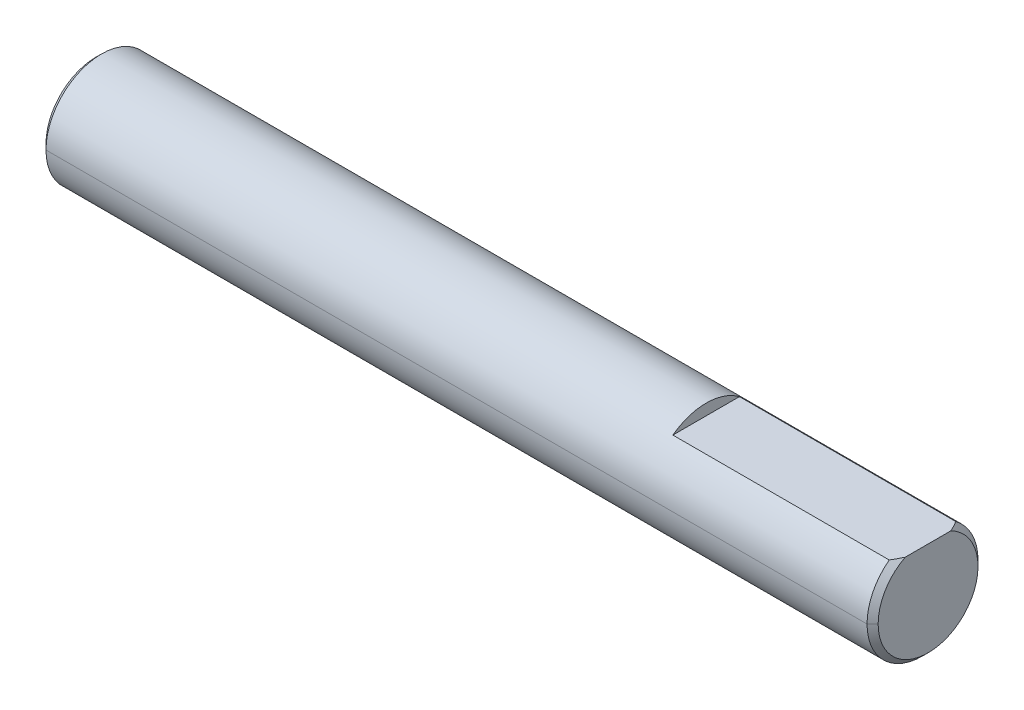
ISO-10303-21;
HEADER;
FILE_DESCRIPTION(('STEP AP214'),'2;1');
FILE_NAME('part.step','',(''),(''),'','','');
FILE_SCHEMA(('AUTOMOTIVE_DESIGN { 1 0 10303 214 1 1 1 1 }'));
ENDSEC;
DATA;
#1=APPLICATION_CONTEXT('core data for automotive mechanical design processes');
#2=APPLICATION_PROTOCOL_DEFINITION('international standard','automotive_design',2000,#1);
#3=PRODUCT_CONTEXT('',#1,'mechanical');
#4=PRODUCT('Part','Part','',(#3));
#5=PRODUCT_RELATED_PRODUCT_CATEGORY('part','',(#4));
#6=PRODUCT_DEFINITION_FORMATION('','',#4);
#7=PRODUCT_DEFINITION_CONTEXT('part definition',#1,'design');
#8=PRODUCT_DEFINITION('design','',#6,#7);
#9=PRODUCT_DEFINITION_SHAPE('','',#8);
#10=(LENGTH_UNIT() NAMED_UNIT(*) SI_UNIT(.MILLI.,.METRE.));
#11=(NAMED_UNIT(*) PLANE_ANGLE_UNIT() SI_UNIT($,.RADIAN.));
#12=(NAMED_UNIT(*) SI_UNIT($,.STERADIAN.) SOLID_ANGLE_UNIT());
#13=UNCERTAINTY_MEASURE_WITH_UNIT(LENGTH_MEASURE(1.E-05),#10,'distance_accuracy_value','');
#14=(GEOMETRIC_REPRESENTATION_CONTEXT(3) GLOBAL_UNCERTAINTY_ASSIGNED_CONTEXT((#13)) GLOBAL_UNIT_ASSIGNED_CONTEXT((#10,
#11,#12)) REPRESENTATION_CONTEXT('',''));
#15=CARTESIAN_POINT('',(0.,0.,0.));
#16=DIRECTION('',(0.,0.,1.));
#17=DIRECTION('',(1.,0.,0.));
#18=AXIS2_PLACEMENT_3D('',#15,#16,#17);
#19=CARTESIAN_POINT('',(75.,4.5,0.));
#20=DIRECTION('',(-1.,0.,0.));
#21=DIRECTION('',(0.,0.,1.));
#22=AXIS2_PLACEMENT_3D('',#19,#20,#21);
#23=PLANE('',#22);
#24=DIRECTION('',(0.,0.,-1.));
#25=VECTOR('',#24,1.);
#26=CARTESIAN_POINT('',(75.,4.,0.));
#27=LINE('',#26,#25);
#28=CARTESIAN_POINT('',(75.,4.,2.06155281280883));
#29=VERTEX_POINT('',#28);
#30=CARTESIAN_POINT('',(75.,4.,-2.06155281280883));
#31=VERTEX_POINT('',#30);
#32=EDGE_CURVE('E10',#29,#31,#27,.T.);
#33=ORIENTED_EDGE('',*,*,#32,.F.);
#34=CARTESIAN_POINT('',(75.,0.,0.));
#35=DIRECTION('',(1.,0.,0.));
#36=DIRECTION('',(0.,0.,-1.));
#37=AXIS2_PLACEMENT_3D('',#34,#35,#36);
#38=CIRCLE('',#37,4.5);
#39=CARTESIAN_POINT('',(74.9999999999988,0.,4.49999999999868));
#40=VERTEX_POINT('',#39);
#41=EDGE_CURVE('E24',#29,#40,#38,.T.);
#42=ORIENTED_EDGE('',*,*,#41,.T.);
#43=CARTESIAN_POINT('',(75.,0.,0.));
#44=DIRECTION('',(1.,0.,0.));
#45=DIRECTION('',(0.,0.,-1.));
#46=AXIS2_PLACEMENT_3D('',#43,#44,#45);
#47=CIRCLE('',#46,4.5);
#48=EDGE_CURVE('E461',#40,#31,#47,.T.);
#49=ORIENTED_EDGE('',*,*,#48,.T.);
#50=EDGE_LOOP('',(#33,#42,#49));
#51=FACE_BOUND('',#50,.T.);
#52=ADVANCED_FACE('F16',(#51),#23,.F.);
#53=CARTESIAN_POINT('',(74.5,0.,0.));
#54=DIRECTION('',(-1.,0.,0.));
#55=DIRECTION('',(0.,0.,1.));
#56=AXIS2_PLACEMENT_3D('',#53,#54,#55);
#57=CONICAL_SURFACE('',#56,5.,0.7853981634);
#58=CARTESIAN_POINT('',(74.5,0.,0.));
#59=DIRECTION('',(1.,0.,0.));
#60=DIRECTION('',(0.,0.,-1.));
#61=AXIS2_PLACEMENT_3D('',#58,#59,#60);
#62=CIRCLE('',#61,5.);
#63=CARTESIAN_POINT('',(74.5,0.,5.));
#64=VERTEX_POINT('',#63);
#65=CARTESIAN_POINT('',(74.5,0.,-5.));
#66=VERTEX_POINT('',#65);
#67=EDGE_CURVE('E457',#64,#66,#62,.T.);
#68=ORIENTED_EDGE('',*,*,#67,.T.);
#69=CARTESIAN_POINT('',(74.5,0.,0.));
#70=DIRECTION('',(1.,0.,0.));
#71=DIRECTION('',(0.,0.,-1.));
#72=AXIS2_PLACEMENT_3D('',#69,#70,#71);
#73=CIRCLE('',#72,5.);
#74=CARTESIAN_POINT('',(74.5,4.,-3.));
#75=VERTEX_POINT('',#74);
#76=EDGE_CURVE('E455',#66,#75,#73,.T.);
#77=ORIENTED_EDGE('',*,*,#76,.T.);
#78=CARTESIAN_POINT('',(75.,4.,-2.06155281280886));
#79=CARTESIAN_POINT('',(74.8518662474413,4.,-2.38490222320115));
#80=CARTESIAN_POINT('',(74.6823432963807,4.,-2.69609450603217));
#81=CARTESIAN_POINT('',(74.5,4.,-3.));
#82=B_SPLINE_CURVE_WITH_KNOTS('',3,(#78,#79,#80,#81),.UNSPECIFIED.,.F.,.F.,(4,4),
(0.0147760264440065,0.0158503428778367),.UNSPECIFIED.);
#83=EDGE_CURVE('E454',#31,#75,#82,.T.);
#84=ORIENTED_EDGE('',*,*,#83,.F.);
#85=ORIENTED_EDGE('',*,*,#48,.F.);
#86=DIRECTION('',(-0.707106781184743,0.,0.707106781188353));
#87=VECTOR('',#86,1.);
#88=CARTESIAN_POINT('',(74.9999999999988,0.,4.49999999999868));
#89=LINE('',#88,#87);
#90=EDGE_CURVE('E470',#40,#64,#89,.T.);
#91=ORIENTED_EDGE('',*,*,#90,.T.);
#92=EDGE_LOOP('',(#68,#77,#84,#85,#91));
#93=FACE_BOUND('',#92,.T.);
#94=ADVANCED_FACE('F435',(#93),#57,.T.);
#95=CARTESIAN_POINT('',(74.5,0.,0.));
#96=DIRECTION('',(-1.,0.,0.));
#97=DIRECTION('',(0.,0.,1.));
#98=AXIS2_PLACEMENT_3D('',#95,#96,#97);
#99=CONICAL_SURFACE('',#98,5.,0.7853981634);
#100=CARTESIAN_POINT('',(74.5,4.,3.));
#101=CARTESIAN_POINT('',(74.6829169757836,4.,2.69513837369405));
#102=CARTESIAN_POINT('',(74.8524134561749,4.,2.38370776469111));
#103=CARTESIAN_POINT('',(75.0000000000001,4.,2.06155281280887));
#104=B_SPLINE_CURVE_WITH_KNOTS('',3,(#100,#101,#102,#103),.UNSPECIFIED.,.F.,.F.,(4,4),
(0.00943422289765468,0.0104983854679327),.UNSPECIFIED.);
#105=CARTESIAN_POINT('',(74.5,4.,3.));
#106=VERTEX_POINT('',#105);
#107=EDGE_CURVE('E420',#106,#29,#104,.T.);
#108=ORIENTED_EDGE('',*,*,#107,.F.);
#109=CARTESIAN_POINT('',(74.5,0.,0.));
#110=DIRECTION('',(1.,0.,0.));
#111=DIRECTION('',(0.,0.,-1.));
#112=AXIS2_PLACEMENT_3D('',#109,#110,#111);
#113=CIRCLE('',#112,5.);
#114=EDGE_CURVE('E415',#106,#64,#113,.T.);
#115=ORIENTED_EDGE('',*,*,#114,.T.);
#116=ORIENTED_EDGE('',*,*,#90,.F.);
#117=ORIENTED_EDGE('',*,*,#41,.F.);
#118=EDGE_LOOP('',(#108,#115,#116,#117));
#119=FACE_BOUND('',#118,.T.);
#120=ADVANCED_FACE('F427',(#119),#99,.T.);
#121=CARTESIAN_POINT('',(75.,0.,0.));
#122=DIRECTION('',(-1.,0.,0.));
#123=DIRECTION('',(0.,-1.,0.));
#124=AXIS2_PLACEMENT_3D('',#121,#122,#123);
#125=CYLINDRICAL_SURFACE('',#124,5.);
#126=ORIENTED_EDGE('',*,*,#114,.F.);
#127=DIRECTION('',(1.,0.,0.));
#128=VECTOR('',#127,1.);
#129=CARTESIAN_POINT('',(75.,4.,3.));
#130=LINE('',#129,#128);
#131=CARTESIAN_POINT('',(55.,4.,3.));
#132=VERTEX_POINT('',#131);
#133=EDGE_CURVE('E410',#132,#106,#130,.T.);
#134=ORIENTED_EDGE('',*,*,#133,.F.);
#135=CARTESIAN_POINT('',(55.,0.,0.));
#136=DIRECTION('',(1.,0.,0.));
#137=DIRECTION('',(0.,0.,-1.));
#138=AXIS2_PLACEMENT_3D('',#135,#136,#137);
#139=CIRCLE('',#138,5.);
#140=CARTESIAN_POINT('',(55.,4.,-3.));
#141=VERTEX_POINT('',#140);
#142=EDGE_CURVE('E405',#141,#132,#139,.T.);
#143=ORIENTED_EDGE('',*,*,#142,.F.);
#144=DIRECTION('',(1.,0.,0.));
#145=VECTOR('',#144,1.);
#146=CARTESIAN_POINT('',(75.,4.,-3.));
#147=LINE('',#146,#145);
#148=EDGE_CURVE('E402',#141,#75,#147,.T.);
#149=ORIENTED_EDGE('',*,*,#148,.T.);
#150=ORIENTED_EDGE('',*,*,#76,.F.);
#151=CARTESIAN_POINT('',(74.5,0.,-5.));
#152=DIRECTION('',(-1.,0.,0.));
#153=VECTOR('',#152,1.);
#154=LINE('',#151,#153);
#155=CARTESIAN_POINT('',(0.5,0.,-5.));
#156=VERTEX_POINT('',#155);
#157=EDGE_CURVE('E371',#66,#156,#154,.T.);
#158=ORIENTED_EDGE('',*,*,#157,.T.);
#159=CARTESIAN_POINT('',(0.5,0.,0.));
#160=DIRECTION('',(1.,0.,0.));
#161=DIRECTION('',(0.,0.,-1.));
#162=AXIS2_PLACEMENT_3D('',#159,#160,#161);
#163=CIRCLE('',#162,5.);
#164=CARTESIAN_POINT('',(0.5,0.,5.));
#165=VERTEX_POINT('',#164);
#166=EDGE_CURVE('E388',#156,#165,#163,.T.);
#167=ORIENTED_EDGE('',*,*,#166,.T.);
#168=CARTESIAN_POINT('',(74.5,0.,5.));
#169=DIRECTION('',(-1.,0.,0.));
#170=VECTOR('',#169,1.);
#171=LINE('',#168,#170);
#172=EDGE_CURVE('E373',#64,#165,#171,.T.);
#173=ORIENTED_EDGE('',*,*,#172,.F.);
#174=EDGE_LOOP('',(#126,#134,#143,#149,#150,#158,#167,#173));
#175=FACE_BOUND('',#174,.T.);
#176=ADVANCED_FACE('F354',(#175),#125,.T.);
#177=CARTESIAN_POINT('',(75.,0.,0.));
#178=DIRECTION('',(-1.,0.,0.));
#179=DIRECTION('',(0.,1.,0.));
#180=AXIS2_PLACEMENT_3D('',#177,#178,#179);
#181=CYLINDRICAL_SURFACE('',#180,5.);
#182=CARTESIAN_POINT('',(0.5,0.,0.));
#183=DIRECTION('',(1.,0.,0.));
#184=DIRECTION('',(0.,0.,-1.));
#185=AXIS2_PLACEMENT_3D('',#182,#183,#184);
#186=CIRCLE('',#185,5.);
#187=EDGE_CURVE('E337',#165,#156,#186,.T.);
#188=ORIENTED_EDGE('',*,*,#187,.T.);
#189=ORIENTED_EDGE('',*,*,#157,.F.);
#190=ORIENTED_EDGE('',*,*,#67,.F.);
#191=ORIENTED_EDGE('',*,*,#172,.T.);
#192=EDGE_LOOP('',(#188,#189,#190,#191));
#193=FACE_BOUND('',#192,.T.);
#194=ADVANCED_FACE('F345',(#193),#181,.T.);
#195=CARTESIAN_POINT('',(0.,0.,0.));
#196=DIRECTION('',(1.,0.,0.));
#197=DIRECTION('',(0.,1.,0.));
#198=AXIS2_PLACEMENT_3D('',#195,#196,#197);
#199=CONICAL_SURFACE('',#198,4.5,0.7853981634);
#200=CARTESIAN_POINT('',(0.,0.,0.));
#201=DIRECTION('',(1.,0.,0.));
#202=DIRECTION('',(0.,0.,-1.));
#203=AXIS2_PLACEMENT_3D('',#200,#201,#202);
#204=CIRCLE('',#203,4.5);
#205=CARTESIAN_POINT('',(0.,0.,4.5));
#206=VERTEX_POINT('',#205);
#207=CARTESIAN_POINT('',(0.,0.,-4.5));
#208=VERTEX_POINT('',#207);
#209=EDGE_CURVE('E335',#206,#208,#204,.T.);
#210=ORIENTED_EDGE('',*,*,#209,.T.);
#211=CARTESIAN_POINT('',(0.,0.,-4.5));
#212=DIRECTION('',(0.707106781184743,0.,-0.707106781188352));
#213=VECTOR('',#212,1.);
#214=LINE('',#211,#213);
#215=EDGE_CURVE('E312',#208,#156,#214,.T.);
#216=ORIENTED_EDGE('',*,*,#215,.T.);
#217=ORIENTED_EDGE('',*,*,#187,.F.);
#218=CARTESIAN_POINT('',(0.,0.,4.5));
#219=DIRECTION('',(0.707106781184743,0.,0.707106781188352));
#220=VECTOR('',#219,1.);
#221=LINE('',#218,#220);
#222=EDGE_CURVE('E325',#206,#165,#221,.T.);
#223=ORIENTED_EDGE('',*,*,#222,.F.);
#224=EDGE_LOOP('',(#210,#216,#217,#223));
#225=FACE_BOUND('',#224,.T.);
#226=ADVANCED_FACE('F291',(#225),#199,.T.);
#227=CARTESIAN_POINT('',(0.,0.,0.));
#228=DIRECTION('',(1.,0.,0.));
#229=DIRECTION('',(0.,-1.,0.));
#230=AXIS2_PLACEMENT_3D('',#227,#228,#229);
#231=CONICAL_SURFACE('',#230,4.5,0.7853981634);
#232=ORIENTED_EDGE('',*,*,#166,.F.);
#233=ORIENTED_EDGE('',*,*,#215,.F.);
#234=CARTESIAN_POINT('',(0.,0.,0.));
#235=DIRECTION('',(1.,0.,0.));
#236=DIRECTION('',(0.,0.,-1.));
#237=AXIS2_PLACEMENT_3D('',#234,#235,#236);
#238=CIRCLE('',#237,4.5);
#239=EDGE_CURVE('E274',#208,#206,#238,.T.);
#240=ORIENTED_EDGE('',*,*,#239,.T.);
#241=ORIENTED_EDGE('',*,*,#222,.T.);
#242=EDGE_LOOP('',(#232,#233,#240,#241));
#243=FACE_BOUND('',#242,.T.);
#244=ADVANCED_FACE('F282',(#243),#231,.T.);
#245=CARTESIAN_POINT('',(0.,0.,0.));
#246=DIRECTION('',(1.,0.,0.));
#247=DIRECTION('',(0.,0.,-1.));
#248=AXIS2_PLACEMENT_3D('',#245,#246,#247);
#249=PLANE('',#248);
#250=ORIENTED_EDGE('',*,*,#239,.F.);
#251=ORIENTED_EDGE('',*,*,#209,.F.);
#252=EDGE_LOOP('',(#250,#251));
#253=FACE_BOUND('',#252,.T.);
#254=CARTESIAN_POINT('',(0.,0.,0.));
#255=DIRECTION('',(1.,0.,0.));
#256=DIRECTION('',(0.,0.,-1.));
#257=AXIS2_PLACEMENT_3D('',#254,#255,#256);
#258=CIRCLE('',#257,2.);
#259=CARTESIAN_POINT('',(0.,0.,-2.));
#260=VERTEX_POINT('',#259);
#261=CARTESIAN_POINT('',(0.,0.,2.));
#262=VERTEX_POINT('',#261);
#263=EDGE_CURVE('E270',#260,#262,#258,.T.);
#264=ORIENTED_EDGE('',*,*,#263,.T.);
#265=CARTESIAN_POINT('',(0.,0.,0.));
#266=DIRECTION('',(1.,0.,0.));
#267=DIRECTION('',(0.,0.,-1.));
#268=AXIS2_PLACEMENT_3D('',#265,#266,#267);
#269=CIRCLE('',#268,2.);
#270=EDGE_CURVE('E268',#262,#260,#269,.T.);
#271=ORIENTED_EDGE('',*,*,#270,.T.);
#272=EDGE_LOOP('',(#264,#271));
#273=FACE_BOUND('',#272,.T.);
#274=ADVANCED_FACE('F251',(#253,#273),#249,.F.);
#275=CARTESIAN_POINT('',(0.,0.,0.));
#276=DIRECTION('',(-1.,0.,0.));
#277=DIRECTION('',(0.,1.,0.));
#278=AXIS2_PLACEMENT_3D('',#275,#276,#277);
#279=CONICAL_SURFACE('',#278,2.,0.7853981634);
#280=ORIENTED_EDGE('',*,*,#270,.F.);
#281=CARTESIAN_POINT('',(0.378999999999033,0.,1.62099999999903));
#282=DIRECTION('',(-0.707106781184743,0.,0.707106781188352));
#283=VECTOR('',#282,1.);
#284=LINE('',#281,#283);
#285=CARTESIAN_POINT('',(0.378999999999033,0.,1.62099999999903));
#286=VERTEX_POINT('',#285);
#287=EDGE_CURVE('E234',#286,#262,#284,.T.);
#288=ORIENTED_EDGE('',*,*,#287,.F.);
#289=CARTESIAN_POINT('',(0.379000000000001,0.,0.));
#290=DIRECTION('',(1.,0.,0.));
#291=DIRECTION('',(0.,0.,-1.));
#292=AXIS2_PLACEMENT_3D('',#289,#290,#291);
#293=CIRCLE('',#292,1.621);
#294=CARTESIAN_POINT('',(0.379000000000001,0.,-1.621));
#295=VERTEX_POINT('',#294);
#296=EDGE_CURVE('E502',#286,#295,#293,.T.);
#297=ORIENTED_EDGE('',*,*,#296,.T.);
#298=CARTESIAN_POINT('',(0.378999999999033,0.,-1.62099999999903));
#299=DIRECTION('',(-0.707106781184743,0.,-0.707106781188352));
#300=VECTOR('',#299,1.);
#301=LINE('',#298,#300);
#302=EDGE_CURVE('E223',#295,#260,#301,.T.);
#303=ORIENTED_EDGE('',*,*,#302,.T.);
#304=EDGE_LOOP('',(#280,#288,#297,#303));
#305=FACE_BOUND('',#304,.T.);
#306=ADVANCED_FACE('F242',(#305),#279,.F.);
#307=CARTESIAN_POINT('',(0.,0.,0.));
#308=DIRECTION('',(-1.,0.,0.));
#309=DIRECTION('',(0.,-1.,0.));
#310=AXIS2_PLACEMENT_3D('',#307,#308,#309);
#311=CONICAL_SURFACE('',#310,2.,0.7853981634);
#312=CARTESIAN_POINT('',(0.379000000000001,0.,0.));
#313=DIRECTION('',(1.,0.,0.));
#314=DIRECTION('',(0.,0.,-1.));
#315=AXIS2_PLACEMENT_3D('',#312,#313,#314);
#316=CIRCLE('',#315,1.621);
#317=EDGE_CURVE('E206',#295,#286,#316,.T.);
#318=ORIENTED_EDGE('',*,*,#317,.T.);
#319=ORIENTED_EDGE('',*,*,#287,.T.);
#320=ORIENTED_EDGE('',*,*,#263,.F.);
#321=ORIENTED_EDGE('',*,*,#302,.F.);
#322=EDGE_LOOP('',(#318,#319,#320,#321));
#323=FACE_BOUND('',#322,.T.);
#324=ADVANCED_FACE('F190',(#323),#311,.F.);
#325=CARTESIAN_POINT('',(12.,0.,0.));
#326=DIRECTION('',(-1.,0.,0.));
#327=DIRECTION('',(0.,-1.,0.));
#328=AXIS2_PLACEMENT_3D('',#325,#326,#327);
#329=CYLINDRICAL_SURFACE('',#328,1.621);
#330=CARTESIAN_POINT('',(11.064115213644,0.,0.));
#331=DIRECTION('',(1.,0.,0.));
#332=DIRECTION('',(0.,0.,-1.));
#333=AXIS2_PLACEMENT_3D('',#330,#331,#332);
#334=CIRCLE('',#333,1.621);
#335=CARTESIAN_POINT('',(11.064115213644,0.,-1.621));
#336=VERTEX_POINT('',#335);
#337=CARTESIAN_POINT('',(11.064115213644,0.,1.621));
#338=VERTEX_POINT('',#337);
#339=EDGE_CURVE('E105',#336,#338,#334,.T.);
#340=ORIENTED_EDGE('',*,*,#339,.T.);
#341=CARTESIAN_POINT('',(11.064115213644,0.,1.621));
#342=DIRECTION('',(-1.,0.,0.));
#343=VECTOR('',#342,1.);
#344=LINE('',#341,#343);
#345=EDGE_CURVE('E176',#338,#286,#344,.T.);
#346=ORIENTED_EDGE('',*,*,#345,.T.);
#347=ORIENTED_EDGE('',*,*,#317,.F.);
#348=CARTESIAN_POINT('',(11.064115213644,0.,-1.621));
#349=DIRECTION('',(-1.,0.,0.));
#350=VECTOR('',#349,1.);
#351=LINE('',#348,#350);
#352=EDGE_CURVE('E161',#336,#295,#351,.T.);
#353=ORIENTED_EDGE('',*,*,#352,.F.);
#354=EDGE_LOOP('',(#340,#346,#347,#353));
#355=FACE_BOUND('',#354,.T.);
#356=ADVANCED_FACE('F181',(#355),#329,.F.);
#357=CARTESIAN_POINT('',(12.,0.,0.));
#358=DIRECTION('',(-1.,0.,0.));
#359=DIRECTION('',(0.,1.,0.));
#360=AXIS2_PLACEMENT_3D('',#357,#358,#359);
#361=CYLINDRICAL_SURFACE('',#360,1.621);
#362=ORIENTED_EDGE('',*,*,#296,.F.);
#363=ORIENTED_EDGE('',*,*,#345,.F.);
#364=CARTESIAN_POINT('',(11.064115213644,0.,0.));
#365=DIRECTION('',(1.,0.,0.));
#366=DIRECTION('',(0.,0.,-1.));
#367=AXIS2_PLACEMENT_3D('',#364,#365,#366);
#368=CIRCLE('',#367,1.621);
#369=EDGE_CURVE('E97',#338,#336,#368,.T.);
#370=ORIENTED_EDGE('',*,*,#369,.T.);
#371=ORIENTED_EDGE('',*,*,#352,.T.);
#372=EDGE_LOOP('',(#362,#363,#370,#371));
#373=FACE_BOUND('',#372,.T.);
#374=ADVANCED_FACE('F130',(#373),#361,.F.);
#375=CARTESIAN_POINT('',(11.064115213644,0.,0.));
#376=DIRECTION('',(-1.,0.,0.));
#377=DIRECTION('',(0.,1.,0.));
#378=AXIS2_PLACEMENT_3D('',#375,#376,#377);
#379=CONICAL_SURFACE('',#378,1.621,1.0471975512);
#380=CARTESIAN_POINT('',(11.999999999993,0.,0.));
#381=DIRECTION('',(-0.499999999997054,0.,-0.86602540378614));
#382=VECTOR('',#381,1.);
#383=LINE('',#380,#382);
#384=CARTESIAN_POINT('',(12.,0.,0.));
#385=VERTEX_POINT('',#384);
#386=EDGE_CURVE('E93',#385,#336,#383,.T.);
#387=ORIENTED_EDGE('',*,*,#386,.T.);
#388=ORIENTED_EDGE('',*,*,#369,.F.);
#389=CARTESIAN_POINT('',(11.999999999993,0.,0.));
#390=DIRECTION('',(-0.499999999997054,0.,0.86602540378614));
#391=VECTOR('',#390,1.);
#392=LINE('',#389,#391);
#393=EDGE_CURVE('E89',#385,#338,#392,.T.);
#394=ORIENTED_EDGE('',*,*,#393,.F.);
#395=EDGE_LOOP('',(#387,#388,#394));
#396=FACE_BOUND('',#395,.T.);
#397=ADVANCED_FACE('F92',(#396),#379,.F.);
#398=CARTESIAN_POINT('',(11.064115213644,0.,0.));
#399=DIRECTION('',(-1.,0.,0.));
#400=DIRECTION('',(0.,-1.,0.));
#401=AXIS2_PLACEMENT_3D('',#398,#399,#400);
#402=CONICAL_SURFACE('',#401,1.621,1.0471975512);
#403=ORIENTED_EDGE('',*,*,#393,.T.);
#404=ORIENTED_EDGE('',*,*,#339,.F.);
#405=ORIENTED_EDGE('',*,*,#386,.F.);
#406=EDGE_LOOP('',(#403,#404,#405));
#407=FACE_BOUND('',#406,.T.);
#408=ADVANCED_FACE('F104',(#407),#402,.F.);
#409=CARTESIAN_POINT('',(76.,4.,10.));
#410=DIRECTION('',(0.,1.,0.));
#411=DIRECTION('',(0.,0.,1.));
#412=AXIS2_PLACEMENT_3D('',#409,#410,#411);
#413=PLANE('',#412);
#414=ORIENTED_EDGE('',*,*,#133,.T.);
#415=ORIENTED_EDGE('',*,*,#107,.T.);
#416=ORIENTED_EDGE('',*,*,#32,.T.);
#417=ORIENTED_EDGE('',*,*,#83,.T.);
#418=ORIENTED_EDGE('',*,*,#148,.F.);
#419=DIRECTION('',(0.,0.,-1.));
#420=VECTOR('',#419,1.);
#421=CARTESIAN_POINT('',(55.,4.,10.));
#422=LINE('',#421,#420);
#423=EDGE_CURVE('E100',#132,#141,#422,.T.);
#424=ORIENTED_EDGE('',*,*,#423,.F.);
#425=EDGE_LOOP('',(#414,#415,#416,#417,#418,#424));
#426=FACE_BOUND('',#425,.T.);
#427=ADVANCED_FACE('F123',(#426),#413,.T.);
#428=CARTESIAN_POINT('',(55.,0.,0.));
#429=DIRECTION('',(1.,0.,0.));
#430=DIRECTION('',(0.,0.,-1.));
#431=AXIS2_PLACEMENT_3D('',#428,#429,#430);
#432=PLANE('',#431);
#433=ORIENTED_EDGE('',*,*,#423,.T.);
#434=ORIENTED_EDGE('',*,*,#142,.T.);
#435=EDGE_LOOP('',(#433,#434));
#436=FACE_BOUND('',#435,.T.);
#437=ADVANCED_FACE('F497',(#436),#432,.T.);
#438=CLOSED_SHELL('',(#52,#94,#120,#176,#194,#226,#244,#274,#306,#324,#356,#374,#397,#408,#427,#437));
#439=MANIFOLD_SOLID_BREP('B1',#438);
#440=ADVANCED_BREP_SHAPE_REPRESENTATION('',(#18,#439),#14);
#441=SHAPE_DEFINITION_REPRESENTATION(#9,#440);
ENDSEC;
END-ISO-10303-21;
